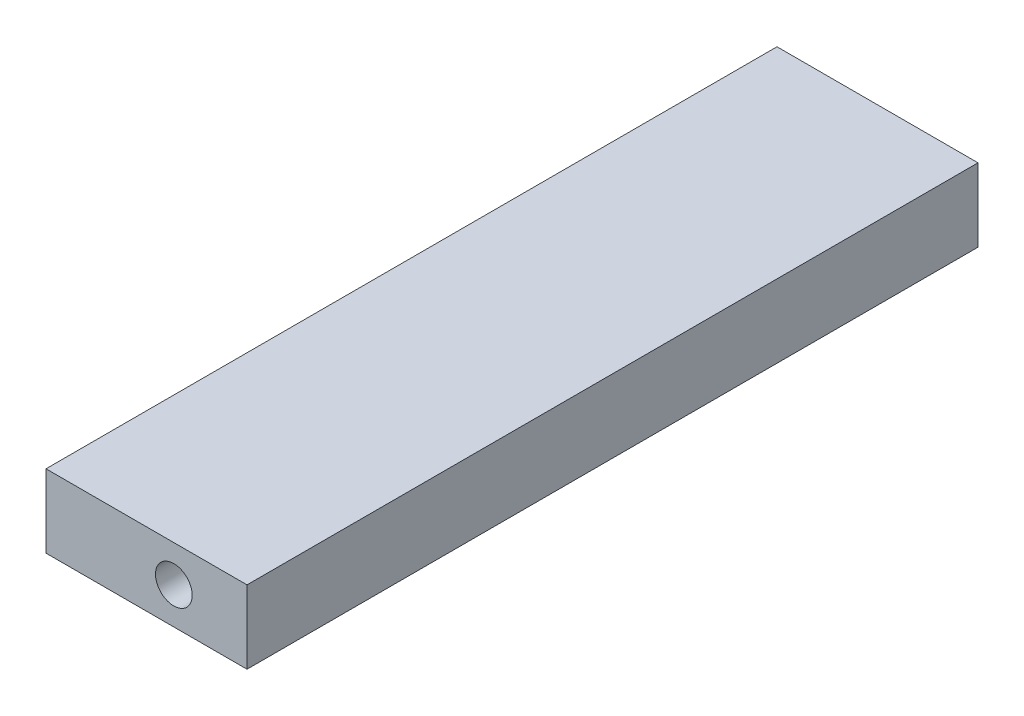
ISO-10303-21;
HEADER;
FILE_DESCRIPTION(('STEP AP214'),'2;1');
FILE_NAME('part.step','',(''),(''),'','','');
FILE_SCHEMA(('AUTOMOTIVE_DESIGN { 1 0 10303 214 1 1 1 1 }'));
ENDSEC;
DATA;
#1=APPLICATION_CONTEXT('core data for automotive mechanical design processes');
#2=APPLICATION_PROTOCOL_DEFINITION('international standard','automotive_design',2000,#1);
#3=PRODUCT_CONTEXT('',#1,'mechanical');
#4=PRODUCT('Part','Part','',(#3));
#5=PRODUCT_RELATED_PRODUCT_CATEGORY('part','',(#4));
#6=PRODUCT_DEFINITION_FORMATION('','',#4);
#7=PRODUCT_DEFINITION_CONTEXT('part definition',#1,'design');
#8=PRODUCT_DEFINITION('design','',#6,#7);
#9=PRODUCT_DEFINITION_SHAPE('','',#8);
#10=(LENGTH_UNIT() NAMED_UNIT(*) SI_UNIT(.MILLI.,.METRE.));
#11=(NAMED_UNIT(*) PLANE_ANGLE_UNIT() SI_UNIT($,.RADIAN.));
#12=(NAMED_UNIT(*) SI_UNIT($,.STERADIAN.) SOLID_ANGLE_UNIT());
#13=UNCERTAINTY_MEASURE_WITH_UNIT(LENGTH_MEASURE(1.E-05),#10,'distance_accuracy_value','');
#14=(GEOMETRIC_REPRESENTATION_CONTEXT(3) GLOBAL_UNCERTAINTY_ASSIGNED_CONTEXT((#13)) GLOBAL_UNIT_ASSIGNED_CONTEXT((#10,
#11,#12)) REPRESENTATION_CONTEXT('',''));
#15=CARTESIAN_POINT('',(0.,0.,0.));
#16=DIRECTION('',(0.,0.,1.));
#17=DIRECTION('',(1.,0.,0.));
#18=AXIS2_PLACEMENT_3D('',#15,#16,#17);
#19=CARTESIAN_POINT('',(-13.97,5.08,101.6));
#20=DIRECTION('',(0.,1.,0.));
#21=DIRECTION('',(0.,0.,1.));
#22=AXIS2_PLACEMENT_3D('',#19,#20,#21);
#23=PLANE('',#22);
#24=DIRECTION('',(1.,0.,0.));
#25=VECTOR('',#24,1.);
#26=CARTESIAN_POINT('',(-13.97,5.08,0.));
#27=LINE('',#26,#25);
#28=CARTESIAN_POINT('',(-13.97,5.08,0.));
#29=VERTEX_POINT('',#28);
#30=CARTESIAN_POINT('',(13.97,5.08,0.));
#31=VERTEX_POINT('',#30);
#32=EDGE_CURVE('E172',#29,#31,#27,.T.);
#33=ORIENTED_EDGE('',*,*,#32,.F.);
#34=DIRECTION('',(0.,0.,-1.));
#35=VECTOR('',#34,1.);
#36=CARTESIAN_POINT('',(-13.97,5.08,101.6));
#37=LINE('',#36,#35);
#38=CARTESIAN_POINT('',(-13.97,5.08,101.6));
#39=VERTEX_POINT('',#38);
#40=EDGE_CURVE('E11',#39,#29,#37,.T.);
#41=ORIENTED_EDGE('',*,*,#40,.F.);
#42=DIRECTION('',(1.,0.,0.));
#43=VECTOR('',#42,1.);
#44=CARTESIAN_POINT('',(-13.97,5.08,101.6));
#45=LINE('',#44,#43);
#46=CARTESIAN_POINT('',(13.97,5.08,101.6));
#47=VERTEX_POINT('',#46);
#48=EDGE_CURVE('E176',#39,#47,#45,.T.);
#49=ORIENTED_EDGE('',*,*,#48,.T.);
#50=DIRECTION('',(0.,0.,-1.));
#51=VECTOR('',#50,1.);
#52=CARTESIAN_POINT('',(13.97,5.08,101.6));
#53=LINE('',#52,#51);
#54=EDGE_CURVE('E48',#47,#31,#53,.T.);
#55=ORIENTED_EDGE('',*,*,#54,.T.);
#56=EDGE_LOOP('',(#33,#41,#49,#55));
#57=FACE_BOUND('',#56,.T.);
#58=ADVANCED_FACE('F45',(#57),#23,.T.);
#59=CARTESIAN_POINT('',(-13.97,-5.08,101.6));
#60=DIRECTION('',(-1.,0.,0.));
#61=DIRECTION('',(0.,0.,1.));
#62=AXIS2_PLACEMENT_3D('',#59,#60,#61);
#63=PLANE('',#62);
#64=CARTESIAN_POINT('',(-13.97,0.,16.5354));
#65=DIRECTION('',(-1.,0.,0.));
#66=DIRECTION('',(0.,0.,1.));
#67=AXIS2_PLACEMENT_3D('',#64,#65,#66);
#68=CIRCLE('',#67,2.5527);
#69=CARTESIAN_POINT('',(-13.97,0.,19.0881));
#70=VERTEX_POINT('',#69);
#71=EDGE_CURVE('E123',#70,#70,#68,.T.);
#72=ORIENTED_EDGE('',*,*,#71,.F.);
#73=EDGE_LOOP('',(#72));
#74=FACE_BOUND('',#73,.T.);
#75=CARTESIAN_POINT('',(-13.97,0.,33.0454));
#76=DIRECTION('',(-1.,0.,0.));
#77=DIRECTION('',(0.,0.,1.));
#78=AXIS2_PLACEMENT_3D('',#75,#76,#77);
#79=CIRCLE('',#78,2.5527);
#80=CARTESIAN_POINT('',(-13.97,0.,35.5981));
#81=VERTEX_POINT('',#80);
#82=EDGE_CURVE('E130',#81,#81,#79,.T.);
#83=ORIENTED_EDGE('',*,*,#82,.F.);
#84=EDGE_LOOP('',(#83));
#85=FACE_BOUND('',#84,.T.);
#86=CARTESIAN_POINT('',(-13.97,0.,49.5554));
#87=DIRECTION('',(-1.,0.,0.));
#88=DIRECTION('',(0.,0.,1.));
#89=AXIS2_PLACEMENT_3D('',#86,#87,#88);
#90=CIRCLE('',#89,2.5527);
#91=CARTESIAN_POINT('',(-13.97,0.,52.1081));
#92=VERTEX_POINT('',#91);
#93=EDGE_CURVE('E139',#92,#92,#90,.T.);
#94=ORIENTED_EDGE('',*,*,#93,.F.);
#95=EDGE_LOOP('',(#94));
#96=FACE_BOUND('',#95,.T.);
#97=CARTESIAN_POINT('',(-13.97,0.,66.0654));
#98=DIRECTION('',(-1.,0.,0.));
#99=DIRECTION('',(0.,0.,1.));
#100=AXIS2_PLACEMENT_3D('',#97,#98,#99);
#101=CIRCLE('',#100,2.5527);
#102=CARTESIAN_POINT('',(-13.97,0.,68.6181));
#103=VERTEX_POINT('',#102);
#104=EDGE_CURVE('E149',#103,#103,#101,.T.);
#105=ORIENTED_EDGE('',*,*,#104,.F.);
#106=EDGE_LOOP('',(#105));
#107=FACE_BOUND('',#106,.T.);
#108=CARTESIAN_POINT('',(-13.97,0.,82.5754));
#109=DIRECTION('',(-1.,0.,0.));
#110=DIRECTION('',(0.,0.,1.));
#111=AXIS2_PLACEMENT_3D('',#108,#109,#110);
#112=CIRCLE('',#111,2.5527);
#113=CARTESIAN_POINT('',(-13.97,0.,85.1281));
#114=VERTEX_POINT('',#113);
#115=EDGE_CURVE('E159',#114,#114,#112,.T.);
#116=ORIENTED_EDGE('',*,*,#115,.F.);
#117=EDGE_LOOP('',(#116));
#118=FACE_BOUND('',#117,.T.);
#119=DIRECTION('',(0.,1.,0.));
#120=VECTOR('',#119,1.);
#121=CARTESIAN_POINT('',(-13.97,-5.08,0.));
#122=LINE('',#121,#120);
#123=CARTESIAN_POINT('',(-13.97,-5.08,0.));
#124=VERTEX_POINT('',#123);
#125=EDGE_CURVE('E181',#124,#29,#122,.T.);
#126=ORIENTED_EDGE('',*,*,#125,.F.);
#127=DIRECTION('',(0.,0.,-1.));
#128=VECTOR('',#127,1.);
#129=CARTESIAN_POINT('',(-13.97,-5.08,101.6));
#130=LINE('',#129,#128);
#131=CARTESIAN_POINT('',(-13.97,-5.08,101.6));
#132=VERTEX_POINT('',#131);
#133=EDGE_CURVE('E54',#132,#124,#130,.T.);
#134=ORIENTED_EDGE('',*,*,#133,.F.);
#135=DIRECTION('',(0.,1.,0.));
#136=VECTOR('',#135,1.);
#137=CARTESIAN_POINT('',(-13.97,-5.08,101.6));
#138=LINE('',#137,#136);
#139=EDGE_CURVE('E187',#132,#39,#138,.T.);
#140=ORIENTED_EDGE('',*,*,#139,.T.);
#141=ORIENTED_EDGE('',*,*,#40,.T.);
#142=EDGE_LOOP('',(#126,#134,#140,#141));
#143=FACE_BOUND('',#142,.T.);
#144=ADVANCED_FACE('F223',(#74,#85,#96,#107,#118,#143),#63,.T.);
#145=CARTESIAN_POINT('',(-13.97,-5.08,101.6));
#146=DIRECTION('',(0.,1.,0.));
#147=DIRECTION('',(0.,0.,1.));
#148=AXIS2_PLACEMENT_3D('',#145,#146,#147);
#149=PLANE('',#148);
#150=DIRECTION('',(1.,0.,0.));
#151=VECTOR('',#150,1.);
#152=CARTESIAN_POINT('',(-13.97,-5.08,0.));
#153=LINE('',#152,#151);
#154=CARTESIAN_POINT('',(13.97,-5.08,0.));
#155=VERTEX_POINT('',#154);
#156=EDGE_CURVE('E198',#124,#155,#153,.T.);
#157=ORIENTED_EDGE('',*,*,#156,.T.);
#158=DIRECTION('',(0.,0.,-1.));
#159=VECTOR('',#158,1.);
#160=CARTESIAN_POINT('',(13.97,-5.08,101.6));
#161=LINE('',#160,#159);
#162=CARTESIAN_POINT('',(13.97,-5.08,101.6));
#163=VERTEX_POINT('',#162);
#164=EDGE_CURVE('E205',#163,#155,#161,.T.);
#165=ORIENTED_EDGE('',*,*,#164,.F.);
#166=DIRECTION('',(1.,0.,0.));
#167=VECTOR('',#166,1.);
#168=CARTESIAN_POINT('',(-13.97,-5.08,101.6));
#169=LINE('',#168,#167);
#170=EDGE_CURVE('E184',#132,#163,#169,.T.);
#171=ORIENTED_EDGE('',*,*,#170,.F.);
#172=ORIENTED_EDGE('',*,*,#133,.T.);
#173=EDGE_LOOP('',(#157,#165,#171,#172));
#174=FACE_BOUND('',#173,.T.);
#175=ADVANCED_FACE('F229',(#174),#149,.F.);
#176=CARTESIAN_POINT('',(13.97,-5.08,101.6));
#177=DIRECTION('',(-1.,0.,0.));
#178=DIRECTION('',(0.,0.,1.));
#179=AXIS2_PLACEMENT_3D('',#176,#177,#178);
#180=PLANE('',#179);
#181=DIRECTION('',(0.,1.,0.));
#182=VECTOR('',#181,1.);
#183=CARTESIAN_POINT('',(13.97,-5.08,0.));
#184=LINE('',#183,#182);
#185=EDGE_CURVE('E194',#155,#31,#184,.T.);
#186=ORIENTED_EDGE('',*,*,#185,.T.);
#187=ORIENTED_EDGE('',*,*,#54,.F.);
#188=DIRECTION('',(0.,1.,0.));
#189=VECTOR('',#188,1.);
#190=CARTESIAN_POINT('',(13.97,-5.08,101.6));
#191=LINE('',#190,#189);
#192=EDGE_CURVE('E180',#163,#47,#191,.T.);
#193=ORIENTED_EDGE('',*,*,#192,.F.);
#194=ORIENTED_EDGE('',*,*,#164,.T.);
#195=EDGE_LOOP('',(#186,#187,#193,#194));
#196=FACE_BOUND('',#195,.T.);
#197=ADVANCED_FACE('F217',(#196),#180,.F.);
#198=CARTESIAN_POINT('',(0.,0.,101.6));
#199=DIRECTION('',(0.,0.,1.));
#200=DIRECTION('',(1.,0.,0.));
#201=AXIS2_PLACEMENT_3D('',#198,#199,#200);
#202=PLANE('',#201);
#203=CARTESIAN_POINT('',(3.7973,0.,101.6));
#204=DIRECTION('',(0.,0.,-1.));
#205=DIRECTION('',(-1.,0.,0.));
#206=AXIS2_PLACEMENT_3D('',#203,#204,#205);
#207=CIRCLE('',#206,2.5527);
#208=CARTESIAN_POINT('',(1.2446,0.,101.6));
#209=VERTEX_POINT('',#208);
#210=EDGE_CURVE('E168',#209,#209,#207,.T.);
#211=ORIENTED_EDGE('',*,*,#210,.T.);
#212=EDGE_LOOP('',(#211));
#213=FACE_BOUND('',#212,.T.);
#214=ORIENTED_EDGE('',*,*,#48,.F.);
#215=ORIENTED_EDGE('',*,*,#139,.F.);
#216=ORIENTED_EDGE('',*,*,#170,.T.);
#217=ORIENTED_EDGE('',*,*,#192,.T.);
#218=EDGE_LOOP('',(#214,#215,#216,#217));
#219=FACE_BOUND('',#218,.T.);
#220=ADVANCED_FACE('F227',(#213,#219),#202,.T.);
#221=CARTESIAN_POINT('',(0.,0.,0.));
#222=DIRECTION('',(0.,0.,1.));
#223=DIRECTION('',(1.,0.,0.));
#224=AXIS2_PLACEMENT_3D('',#221,#222,#223);
#225=PLANE('',#224);
#226=ORIENTED_EDGE('',*,*,#32,.T.);
#227=ORIENTED_EDGE('',*,*,#185,.F.);
#228=ORIENTED_EDGE('',*,*,#156,.F.);
#229=ORIENTED_EDGE('',*,*,#125,.T.);
#230=EDGE_LOOP('',(#226,#227,#228,#229));
#231=FACE_BOUND('',#230,.T.);
#232=ADVANCED_FACE('F220',(#231),#225,.F.);
#233=CARTESIAN_POINT('',(3.7973,0.,101.6));
#234=DIRECTION('',(0.,0.,-1.));
#235=DIRECTION('',(-1.,0.,0.));
#236=AXIS2_PLACEMENT_3D('',#233,#234,#235);
#237=CYLINDRICAL_SURFACE('',#236,2.5527);
#238=CARTESIAN_POINT('',(3.7973,0.,16.5354));
#239=DIRECTION('',(-0.707106781186548,0.,0.707106781186547));
#240=DIRECTION('',(-0.707106781186548,0.,-0.707106781186547));
#241=AXIS2_PLACEMENT_3D('',#238,#239,#240);
#242=ELLIPSE('',#241,3.6100629606698,2.5527);
#243=CARTESIAN_POINT('',(3.7973,-2.5527,16.5354));
#244=VERTEX_POINT('',#243);
#245=CARTESIAN_POINT('',(3.7973,2.5527,16.5354));
#246=VERTEX_POINT('',#245);
#247=EDGE_CURVE('E114',#244,#246,#242,.F.);
#248=ORIENTED_EDGE('',*,*,#247,.F.);
#249=CARTESIAN_POINT('',(3.7973,0.,16.5354));
#250=DIRECTION('',(-0.707106781186548,0.,-0.707106781186547));
#251=DIRECTION('',(-0.707106781186548,0.,0.707106781186547));
#252=AXIS2_PLACEMENT_3D('',#249,#250,#251);
#253=ELLIPSE('',#252,3.6100629606698,2.5527);
#254=EDGE_CURVE('E61',#246,#244,#253,.F.);
#255=ORIENTED_EDGE('',*,*,#254,.F.);
#256=EDGE_LOOP('',(#248,#255));
#257=FACE_BOUND('',#256,.T.);
#258=CARTESIAN_POINT('',(3.7973,0.,33.0454));
#259=DIRECTION('',(-0.707106781186548,0.,0.707106781186547));
#260=DIRECTION('',(-0.707106781186548,0.,-0.707106781186547));
#261=AXIS2_PLACEMENT_3D('',#258,#259,#260);
#262=ELLIPSE('',#261,3.6100629606698,2.5527);
#263=CARTESIAN_POINT('',(3.7973,-2.5527,33.0454));
#264=VERTEX_POINT('',#263);
#265=CARTESIAN_POINT('',(3.7973,2.5527,33.0454));
#266=VERTEX_POINT('',#265);
#267=EDGE_CURVE('E118',#264,#266,#262,.F.);
#268=ORIENTED_EDGE('',*,*,#267,.F.);
#269=CARTESIAN_POINT('',(3.7973,0.,33.0454));
#270=DIRECTION('',(-0.707106781186548,0.,-0.707106781186547));
#271=DIRECTION('',(-0.707106781186548,0.,0.707106781186547));
#272=AXIS2_PLACEMENT_3D('',#269,#270,#271);
#273=ELLIPSE('',#272,3.6100629606698,2.5527);
#274=EDGE_CURVE('E68',#266,#264,#273,.F.);
#275=ORIENTED_EDGE('',*,*,#274,.F.);
#276=EDGE_LOOP('',(#268,#275));
#277=FACE_BOUND('',#276,.T.);
#278=CARTESIAN_POINT('',(3.7973,0.,49.5554));
#279=DIRECTION('',(-0.707106781186548,0.,0.707106781186547));
#280=DIRECTION('',(-0.707106781186548,0.,-0.707106781186547));
#281=AXIS2_PLACEMENT_3D('',#278,#279,#280);
#282=ELLIPSE('',#281,3.6100629606698,2.5527);
#283=CARTESIAN_POINT('',(3.7973,-2.5527,49.5554));
#284=VERTEX_POINT('',#283);
#285=CARTESIAN_POINT('',(3.7973,2.5527,49.5554));
#286=VERTEX_POINT('',#285);
#287=EDGE_CURVE('E134',#284,#286,#282,.F.);
#288=ORIENTED_EDGE('',*,*,#287,.F.);
#289=CARTESIAN_POINT('',(3.7973,0.,49.5554));
#290=DIRECTION('',(-0.707106781186548,0.,-0.707106781186547));
#291=DIRECTION('',(-0.707106781186548,0.,0.707106781186547));
#292=AXIS2_PLACEMENT_3D('',#289,#290,#291);
#293=ELLIPSE('',#292,3.6100629606698,2.5527);
#294=EDGE_CURVE('E143',#286,#284,#293,.F.);
#295=ORIENTED_EDGE('',*,*,#294,.F.);
#296=EDGE_LOOP('',(#288,#295));
#297=FACE_BOUND('',#296,.T.);
#298=CARTESIAN_POINT('',(3.7973,0.,66.0654));
#299=DIRECTION('',(-0.707106781186548,0.,0.707106781186547));
#300=DIRECTION('',(-0.707106781186548,0.,-0.707106781186547));
#301=AXIS2_PLACEMENT_3D('',#298,#299,#300);
#302=ELLIPSE('',#301,3.6100629606698,2.5527);
#303=CARTESIAN_POINT('',(3.7973,-2.5527,66.0654));
#304=VERTEX_POINT('',#303);
#305=CARTESIAN_POINT('',(3.7973,2.5527,66.0654));
#306=VERTEX_POINT('',#305);
#307=EDGE_CURVE('E144',#304,#306,#302,.F.);
#308=ORIENTED_EDGE('',*,*,#307,.F.);
#309=CARTESIAN_POINT('',(3.7973,0.,66.0654));
#310=DIRECTION('',(-0.707106781186548,0.,-0.707106781186547));
#311=DIRECTION('',(-0.707106781186548,0.,0.707106781186547));
#312=AXIS2_PLACEMENT_3D('',#309,#310,#311);
#313=ELLIPSE('',#312,3.6100629606698,2.5527);
#314=EDGE_CURVE('E153',#306,#304,#313,.F.);
#315=ORIENTED_EDGE('',*,*,#314,.F.);
#316=EDGE_LOOP('',(#308,#315));
#317=FACE_BOUND('',#316,.T.);
#318=CARTESIAN_POINT('',(3.7973,0.,82.5754));
#319=DIRECTION('',(-0.707106781186548,0.,0.707106781186547));
#320=DIRECTION('',(-0.707106781186548,0.,-0.707106781186547));
#321=AXIS2_PLACEMENT_3D('',#318,#319,#320);
#322=ELLIPSE('',#321,3.6100629606698,2.5527);
#323=CARTESIAN_POINT('',(3.7973,-2.5527,82.5754));
#324=VERTEX_POINT('',#323);
#325=CARTESIAN_POINT('',(3.7973,2.5527,82.5754));
#326=VERTEX_POINT('',#325);
#327=EDGE_CURVE('E154',#324,#326,#322,.F.);
#328=ORIENTED_EDGE('',*,*,#327,.F.);
#329=CARTESIAN_POINT('',(3.7973,0.,82.5754));
#330=DIRECTION('',(-0.707106781186548,0.,-0.707106781186547));
#331=DIRECTION('',(-0.707106781186548,0.,0.707106781186547));
#332=AXIS2_PLACEMENT_3D('',#329,#330,#331);
#333=ELLIPSE('',#332,3.6100629606698,2.5527);
#334=EDGE_CURVE('E163',#326,#324,#333,.F.);
#335=ORIENTED_EDGE('',*,*,#334,.F.);
#336=EDGE_LOOP('',(#328,#335));
#337=FACE_BOUND('',#336,.T.);
#338=ORIENTED_EDGE('',*,*,#210,.F.);
#339=EDGE_LOOP('',(#338));
#340=FACE_BOUND('',#339,.T.);
#341=CARTESIAN_POINT('',(3.7973,0.,7.62));
#342=DIRECTION('',(0.,0.,-1.));
#343=DIRECTION('',(-1.,0.,0.));
#344=AXIS2_PLACEMENT_3D('',#341,#342,#343);
#345=CIRCLE('',#344,2.5527);
#346=CARTESIAN_POINT('',(1.2446,0.,7.62));
#347=VERTEX_POINT('',#346);
#348=EDGE_CURVE('E127',#347,#347,#345,.T.);
#349=ORIENTED_EDGE('',*,*,#348,.T.);
#350=EDGE_LOOP('',(#349));
#351=FACE_BOUND('',#350,.T.);
#352=ADVANCED_FACE('F120',(#257,#277,#297,#317,#337,#340,#351),#237,.F.);
#353=CARTESIAN_POINT('',(3.7973,0.,7.62));
#354=DIRECTION('',(0.,0.,-1.));
#355=DIRECTION('',(-1.,0.,0.));
#356=AXIS2_PLACEMENT_3D('',#353,#354,#355);
#357=PLANE('',#356);
#358=ORIENTED_EDGE('',*,*,#348,.F.);
#359=EDGE_LOOP('',(#358));
#360=FACE_BOUND('',#359,.T.);
#361=ADVANCED_FACE('F285',(#360),#357,.F.);
#362=CARTESIAN_POINT('',(13.971,0.,82.5754));
#363=DIRECTION('',(-1.,0.,0.));
#364=DIRECTION('',(0.,0.,1.));
#365=AXIS2_PLACEMENT_3D('',#362,#363,#364);
#366=CYLINDRICAL_SURFACE('',#365,2.5527);
#367=ORIENTED_EDGE('',*,*,#115,.T.);
#368=EDGE_LOOP('',(#367));
#369=FACE_BOUND('',#368,.T.);
#370=ORIENTED_EDGE('',*,*,#334,.T.);
#371=ORIENTED_EDGE('',*,*,#327,.T.);
#372=EDGE_LOOP('',(#370,#371));
#373=FACE_BOUND('',#372,.T.);
#374=ADVANCED_FACE('F294',(#369,#373),#366,.F.);
#375=CARTESIAN_POINT('',(13.971,0.,66.0654));
#376=DIRECTION('',(-1.,0.,0.));
#377=DIRECTION('',(0.,0.,1.));
#378=AXIS2_PLACEMENT_3D('',#375,#376,#377);
#379=CYLINDRICAL_SURFACE('',#378,2.5527);
#380=ORIENTED_EDGE('',*,*,#104,.T.);
#381=EDGE_LOOP('',(#380));
#382=FACE_BOUND('',#381,.T.);
#383=ORIENTED_EDGE('',*,*,#314,.T.);
#384=ORIENTED_EDGE('',*,*,#307,.T.);
#385=EDGE_LOOP('',(#383,#384));
#386=FACE_BOUND('',#385,.T.);
#387=ADVANCED_FACE('F303',(#382,#386),#379,.F.);
#388=CARTESIAN_POINT('',(13.971,0.,49.5554));
#389=DIRECTION('',(-1.,0.,0.));
#390=DIRECTION('',(0.,0.,1.));
#391=AXIS2_PLACEMENT_3D('',#388,#389,#390);
#392=CYLINDRICAL_SURFACE('',#391,2.5527);
#393=ORIENTED_EDGE('',*,*,#93,.T.);
#394=EDGE_LOOP('',(#393));
#395=FACE_BOUND('',#394,.T.);
#396=ORIENTED_EDGE('',*,*,#294,.T.);
#397=ORIENTED_EDGE('',*,*,#287,.T.);
#398=EDGE_LOOP('',(#396,#397));
#399=FACE_BOUND('',#398,.T.);
#400=ADVANCED_FACE('F313',(#395,#399),#392,.F.);
#401=CARTESIAN_POINT('',(13.971,0.,33.0454));
#402=DIRECTION('',(-1.,0.,0.));
#403=DIRECTION('',(0.,0.,1.));
#404=AXIS2_PLACEMENT_3D('',#401,#402,#403);
#405=CYLINDRICAL_SURFACE('',#404,2.5527);
#406=ORIENTED_EDGE('',*,*,#82,.T.);
#407=EDGE_LOOP('',(#406));
#408=FACE_BOUND('',#407,.T.);
#409=ORIENTED_EDGE('',*,*,#274,.T.);
#410=ORIENTED_EDGE('',*,*,#267,.T.);
#411=EDGE_LOOP('',(#409,#410));
#412=FACE_BOUND('',#411,.T.);
#413=ADVANCED_FACE('F323',(#408,#412),#405,.F.);
#414=CARTESIAN_POINT('',(13.971,0.,16.5354));
#415=DIRECTION('',(-1.,0.,0.));
#416=DIRECTION('',(0.,0.,1.));
#417=AXIS2_PLACEMENT_3D('',#414,#415,#416);
#418=CYLINDRICAL_SURFACE('',#417,2.5527);
#419=ORIENTED_EDGE('',*,*,#71,.T.);
#420=EDGE_LOOP('',(#419));
#421=FACE_BOUND('',#420,.T.);
#422=ORIENTED_EDGE('',*,*,#254,.T.);
#423=ORIENTED_EDGE('',*,*,#247,.T.);
#424=EDGE_LOOP('',(#422,#423));
#425=FACE_BOUND('',#424,.T.);
#426=ADVANCED_FACE('F115',(#421,#425),#418,.F.);
#427=CLOSED_SHELL('',(#58,#144,#175,#197,#220,#232,#352,#361,#374,#387,#400,#413,#426));
#428=MANIFOLD_SOLID_BREP('B2',#427);
#429=ADVANCED_BREP_SHAPE_REPRESENTATION('',(#18,#428),#14);
#430=SHAPE_DEFINITION_REPRESENTATION(#9,#429);
ENDSEC;
END-ISO-10303-21;
